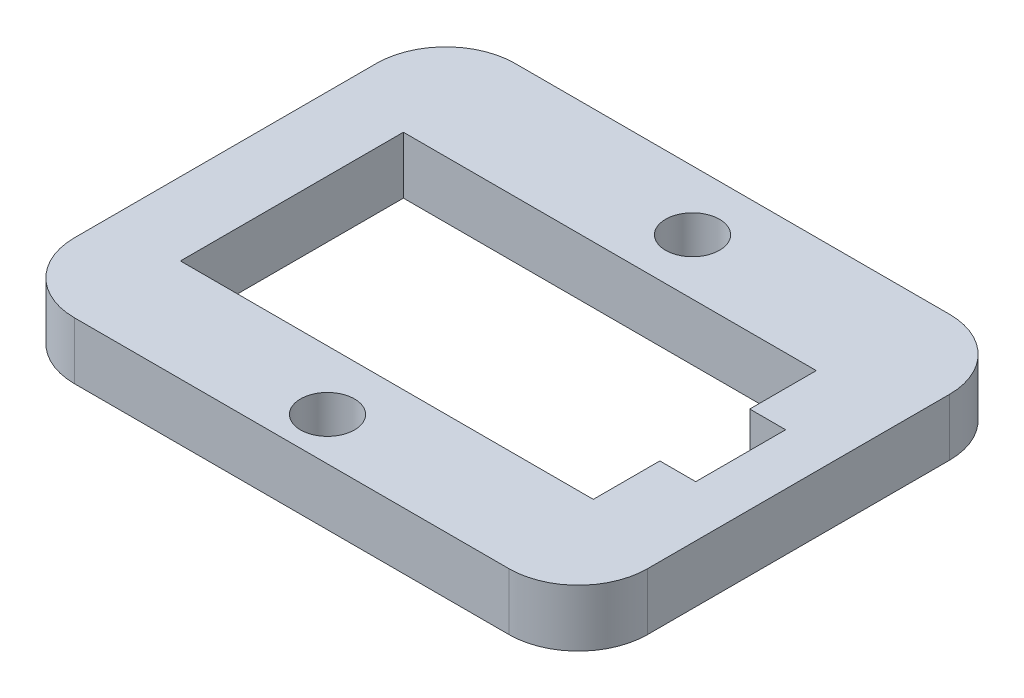
ISO-10303-21;
HEADER;
FILE_DESCRIPTION(('STEP AP214'),'2;1');
FILE_NAME('part.step','',(''),(''),'','','');
FILE_SCHEMA(('AUTOMOTIVE_DESIGN { 1 0 10303 214 1 1 1 1 }'));
ENDSEC;
DATA;
#1=APPLICATION_CONTEXT('core data for automotive mechanical design processes');
#2=APPLICATION_PROTOCOL_DEFINITION('international standard','automotive_design',2000,#1);
#3=PRODUCT_CONTEXT('',#1,'mechanical');
#4=PRODUCT('Part','Part','',(#3));
#5=PRODUCT_RELATED_PRODUCT_CATEGORY('part','',(#4));
#6=PRODUCT_DEFINITION_FORMATION('','',#4);
#7=PRODUCT_DEFINITION_CONTEXT('part definition',#1,'design');
#8=PRODUCT_DEFINITION('design','',#6,#7);
#9=PRODUCT_DEFINITION_SHAPE('','',#8);
#10=(LENGTH_UNIT() NAMED_UNIT(*) SI_UNIT(.MILLI.,.METRE.));
#11=(NAMED_UNIT(*) PLANE_ANGLE_UNIT() SI_UNIT($,.RADIAN.));
#12=(NAMED_UNIT(*) SI_UNIT($,.STERADIAN.) SOLID_ANGLE_UNIT());
#13=UNCERTAINTY_MEASURE_WITH_UNIT(LENGTH_MEASURE(1.E-05),#10,'distance_accuracy_value','');
#14=(GEOMETRIC_REPRESENTATION_CONTEXT(3) GLOBAL_UNCERTAINTY_ASSIGNED_CONTEXT((#13)) GLOBAL_UNIT_ASSIGNED_CONTEXT((#10,
#11,#12)) REPRESENTATION_CONTEXT('',''));
#15=CARTESIAN_POINT('',(0.,0.,0.));
#16=DIRECTION('',(0.,0.,1.));
#17=DIRECTION('',(1.,0.,0.));
#18=AXIS2_PLACEMENT_3D('',#15,#16,#17);
#19=CARTESIAN_POINT('',(-1.43212373794285,3.175,-11.8932817447668));
#20=DIRECTION('',(0.,1.,0.));
#21=DIRECTION('',(0.,0.,1.));
#22=AXIS2_PLACEMENT_3D('',#19,#20,#21);
#23=PLANE('',#22);
#24=CARTESIAN_POINT('',(-12.3988497530969,3.175,-12.4388628064113));
#25=DIRECTION('',(0.,1.,0.));
#26=DIRECTION('',(0.,0.,1.));
#27=AXIS2_PLACEMENT_3D('',#24,#25,#26);
#28=CIRCLE('',#27,1.4986);
#29=CARTESIAN_POINT('',(-12.3988497530969,3.175,-10.9402628064113));
#30=VERTEX_POINT('',#29);
#31=EDGE_CURVE('E184',#30,#30,#28,.T.);
#32=ORIENTED_EDGE('',*,*,#31,.F.);
#33=EDGE_LOOP('',(#32));
#34=FACE_BOUND('',#33,.T.);
#35=CARTESIAN_POINT('',(-1.43212373794285,3.175,-11.8932817447668));
#36=DIRECTION('',(0.,1.,0.));
#37=DIRECTION('',(0.,0.,1.));
#38=AXIS2_PLACEMENT_3D('',#35,#36,#37);
#39=CIRCLE('',#38,3.8628026619089);
#40=CARTESIAN_POINT('',(2.43067892396605,3.175,-11.8932817447668));
#41=VERTEX_POINT('',#40);
#42=CARTESIAN_POINT('',(-1.43212373794285,3.175,-15.7560844066757));
#43=VERTEX_POINT('',#42);
#44=EDGE_CURVE('E214',#41,#43,#39,.T.);
#45=ORIENTED_EDGE('',*,*,#44,.T.);
#46=DIRECTION('',(-1.,0.,0.));
#47=VECTOR('',#46,1.);
#48=CARTESIAN_POINT('',(-1.43212373794285,3.175,-15.7560844066757));
#49=LINE('',#48,#47);
#50=CARTESIAN_POINT('',(-25.5836145207176,3.175,-15.7560844066757));
#51=VERTEX_POINT('',#50);
#52=EDGE_CURVE('E217',#43,#51,#49,.T.);
#53=ORIENTED_EDGE('',*,*,#52,.T.);
#54=CARTESIAN_POINT('',(-25.5836145207176,3.175,-11.9002087767223));
#55=DIRECTION('',(0.,1.,0.));
#56=DIRECTION('',(0.,0.,1.));
#57=AXIS2_PLACEMENT_3D('',#54,#55,#56);
#58=CIRCLE('',#57,3.85587562995337);
#59=CARTESIAN_POINT('',(-29.439490150671,3.175,-11.9002087767223));
#60=VERTEX_POINT('',#59);
#61=EDGE_CURVE('E220',#51,#60,#58,.T.);
#62=ORIENTED_EDGE('',*,*,#61,.T.);
#63=DIRECTION('',(0.,0.,1.));
#64=VECTOR('',#63,1.);
#65=CARTESIAN_POINT('',(-29.439490150671,3.175,-11.9002087767223));
#66=LINE('',#65,#64);
#67=CARTESIAN_POINT('',(-29.439490150671,3.175,4.88188584073093));
#68=VERTEX_POINT('',#67);
#69=EDGE_CURVE('E222',#60,#68,#66,.T.);
#70=ORIENTED_EDGE('',*,*,#69,.T.);
#71=CARTESIAN_POINT('',(-25.576628785035,3.175,4.88188584073093));
#72=DIRECTION('',(0.,1.,0.));
#73=DIRECTION('',(0.,0.,1.));
#74=AXIS2_PLACEMENT_3D('',#71,#72,#73);
#75=CIRCLE('',#74,3.86286136563594);
#76=CARTESIAN_POINT('',(-25.576628785035,3.175,8.74474720636688));
#77=VERTEX_POINT('',#76);
#78=EDGE_CURVE('E224',#68,#77,#75,.T.);
#79=ORIENTED_EDGE('',*,*,#78,.T.);
#80=DIRECTION('',(1.,0.,0.));
#81=VECTOR('',#80,1.);
#82=CARTESIAN_POINT('',(-25.576628785035,3.175,8.74474720636688));
#83=LINE('',#82,#81);
#84=CARTESIAN_POINT('',(-1.42519682285525,3.175,8.74474720636688));
#85=VERTEX_POINT('',#84);
#86=EDGE_CURVE('E226',#77,#85,#83,.T.);
#87=ORIENTED_EDGE('',*,*,#86,.T.);
#88=CARTESIAN_POINT('',(-1.42519682285525,3.175,4.88887145954558));
#89=DIRECTION('',(0.,1.,0.));
#90=DIRECTION('',(0.,0.,1.));
#91=AXIS2_PLACEMENT_3D('',#88,#89,#90);
#92=CIRCLE('',#91,3.8558757468213);
#93=CARTESIAN_POINT('',(2.43067892396605,3.175,4.88887145954558));
#94=VERTEX_POINT('',#93);
#95=EDGE_CURVE('E228',#85,#94,#92,.T.);
#96=ORIENTED_EDGE('',*,*,#95,.T.);
#97=DIRECTION('',(0.,0.,-1.));
#98=VECTOR('',#97,1.);
#99=CARTESIAN_POINT('',(2.43067892396605,3.175,4.88887145954558));
#100=LINE('',#99,#98);
#101=EDGE_CURVE('E230',#94,#41,#100,.T.);
#102=ORIENTED_EDGE('',*,*,#101,.T.);
#103=EDGE_LOOP('',(#45,#53,#62,#70,#79,#87,#96,#102));
#104=FACE_BOUND('',#103,.T.);
#105=DIRECTION('',(-1.,0.,0.));
#106=VECTOR('',#105,1.);
#107=CARTESIAN_POINT('',(-2.41675038914363,3.175,-9.33874606572761));
#108=LINE('',#107,#106);
#109=CARTESIAN_POINT('',(-2.41675038914363,3.175,-9.33874606572761));
#110=VERTEX_POINT('',#109);
#111=CARTESIAN_POINT('',(-25.3759162308973,3.175,-9.33874606572761));
#112=VERTEX_POINT('',#111);
#113=EDGE_CURVE('E154',#110,#112,#108,.T.);
#114=ORIENTED_EDGE('',*,*,#113,.F.);
#115=DIRECTION('',(0.,0.,-1.));
#116=VECTOR('',#115,1.);
#117=CARTESIAN_POINT('',(-2.41675038914363,3.175,-5.63864642458049));
#118=LINE('',#117,#116);
#119=CARTESIAN_POINT('',(-2.41675038914363,3.175,-5.63864642458049));
#120=VERTEX_POINT('',#119);
#121=EDGE_CURVE('E146',#120,#110,#118,.T.);
#122=ORIENTED_EDGE('',*,*,#121,.F.);
#123=DIRECTION('',(-1.,0.,0.));
#124=VECTOR('',#123,1.);
#125=CARTESIAN_POINT('',(-0.420102398048572,3.175,-5.63864642458049));
#126=LINE('',#125,#124);
#127=CARTESIAN_POINT('',(-0.420102398048572,3.175,-5.63864642458049));
#128=VERTEX_POINT('',#127);
#129=EDGE_CURVE('E181',#128,#120,#126,.T.);
#130=ORIENTED_EDGE('',*,*,#129,.F.);
#131=DIRECTION('',(0.,0.,-1.));
#132=VECTOR('',#131,1.);
#133=CARTESIAN_POINT('',(-0.420102398048572,3.175,-0.638495937137135));
#134=LINE('',#133,#132);
#135=CARTESIAN_POINT('',(-0.420102398048572,3.175,-0.638495937137135));
#136=VERTEX_POINT('',#135);
#137=EDGE_CURVE('E179',#136,#128,#134,.T.);
#138=ORIENTED_EDGE('',*,*,#137,.F.);
#139=DIRECTION('',(1.,0.,0.));
#140=VECTOR('',#139,1.);
#141=CARTESIAN_POINT('',(-2.41675038914296,3.175,-0.638495937137135));
#142=LINE('',#141,#140);
#143=CARTESIAN_POINT('',(-2.41675038914296,3.175,-0.638495937137135));
#144=VERTEX_POINT('',#143);
#145=EDGE_CURVE('E177',#144,#136,#142,.T.);
#146=ORIENTED_EDGE('',*,*,#145,.F.);
#147=DIRECTION('',(0.,0.,-1.));
#148=VECTOR('',#147,1.);
#149=CARTESIAN_POINT('',(-2.41675038914296,3.175,3.06160370400997));
#150=LINE('',#149,#148);
#151=CARTESIAN_POINT('',(-2.41675038914296,3.175,3.06160370400997));
#152=VERTEX_POINT('',#151);
#153=EDGE_CURVE('E175',#152,#144,#150,.T.);
#154=ORIENTED_EDGE('',*,*,#153,.F.);
#155=DIRECTION('',(1.,0.,0.));
#156=VECTOR('',#155,1.);
#157=CARTESIAN_POINT('',(-25.3759162308973,3.175,3.06160370400997));
#158=LINE('',#157,#156);
#159=CARTESIAN_POINT('',(-25.3759162308973,3.175,3.06160370400997));
#160=VERTEX_POINT('',#159);
#161=EDGE_CURVE('E170',#160,#152,#158,.T.);
#162=ORIENTED_EDGE('',*,*,#161,.F.);
#163=DIRECTION('',(0.,0.,1.));
#164=VECTOR('',#163,1.);
#165=CARTESIAN_POINT('',(-25.3759162308973,3.175,-9.33874606572761));
#166=LINE('',#165,#164);
#167=EDGE_CURVE('E168',#112,#160,#166,.T.);
#168=ORIENTED_EDGE('',*,*,#167,.F.);
#169=EDGE_LOOP('',(#114,#122,#130,#138,#146,#154,#162,#168));
#170=FACE_BOUND('',#169,.T.);
#171=CARTESIAN_POINT('',(-13.8963966762532,3.175,6.36179287626992));
#172=DIRECTION('',(0.,1.,0.));
#173=DIRECTION('',(0.,0.,1.));
#174=AXIS2_PLACEMENT_3D('',#171,#172,#173);
#175=CIRCLE('',#174,1.4986);
#176=CARTESIAN_POINT('',(-13.8963966762532,3.175,7.86039287626992));
#177=VERTEX_POINT('',#176);
#178=EDGE_CURVE('E370',#177,#177,#175,.T.);
#179=ORIENTED_EDGE('',*,*,#178,.F.);
#180=EDGE_LOOP('',(#179));
#181=FACE_BOUND('',#180,.T.);
#182=ADVANCED_FACE('F33',(#34,#104,#170,#181),#23,.T.);
#183=CARTESIAN_POINT('',(-1.43212373794285,0.,-11.8932817447668));
#184=DIRECTION('',(0.,1.,0.));
#185=DIRECTION('',(0.,0.,1.));
#186=AXIS2_PLACEMENT_3D('',#183,#184,#185);
#187=PLANE('',#186);
#188=CARTESIAN_POINT('',(-1.43212373794285,0.,-11.8932817447668));
#189=DIRECTION('',(0.,1.,0.));
#190=DIRECTION('',(0.,0.,1.));
#191=AXIS2_PLACEMENT_3D('',#188,#189,#190);
#192=CIRCLE('',#191,3.8628026619089);
#193=CARTESIAN_POINT('',(2.43067892396605,0.,-11.8932817447668));
#194=VERTEX_POINT('',#193);
#195=CARTESIAN_POINT('',(-1.43212373794285,0.,-15.7560844066757));
#196=VERTEX_POINT('',#195);
#197=EDGE_CURVE('E162',#194,#196,#192,.T.);
#198=ORIENTED_EDGE('',*,*,#197,.F.);
#199=DIRECTION('',(0.,0.,-1.));
#200=VECTOR('',#199,1.);
#201=CARTESIAN_POINT('',(2.43067892396605,0.,4.88887145954558));
#202=LINE('',#201,#200);
#203=CARTESIAN_POINT('',(2.43067892396605,0.,4.88887145954558));
#204=VERTEX_POINT('',#203);
#205=EDGE_CURVE('E218',#204,#194,#202,.T.);
#206=ORIENTED_EDGE('',*,*,#205,.F.);
#207=CARTESIAN_POINT('',(-1.42519682285525,0.,4.88887145954558));
#208=DIRECTION('',(0.,1.,0.));
#209=DIRECTION('',(0.,0.,1.));
#210=AXIS2_PLACEMENT_3D('',#207,#208,#209);
#211=CIRCLE('',#210,3.8558757468213);
#212=CARTESIAN_POINT('',(-1.42519682285525,0.,8.74474720636688));
#213=VERTEX_POINT('',#212);
#214=EDGE_CURVE('E245',#213,#204,#211,.T.);
#215=ORIENTED_EDGE('',*,*,#214,.F.);
#216=DIRECTION('',(1.,0.,0.));
#217=VECTOR('',#216,1.);
#218=CARTESIAN_POINT('',(-25.576628785035,0.,8.74474720636688));
#219=LINE('',#218,#217);
#220=CARTESIAN_POINT('',(-25.576628785035,0.,8.74474720636688));
#221=VERTEX_POINT('',#220);
#222=EDGE_CURVE('E243',#221,#213,#219,.T.);
#223=ORIENTED_EDGE('',*,*,#222,.F.);
#224=CARTESIAN_POINT('',(-25.576628785035,0.,4.88188584073093));
#225=DIRECTION('',(0.,1.,0.));
#226=DIRECTION('',(0.,0.,1.));
#227=AXIS2_PLACEMENT_3D('',#224,#225,#226);
#228=CIRCLE('',#227,3.86286136563594);
#229=CARTESIAN_POINT('',(-29.439490150671,0.,4.88188584073093));
#230=VERTEX_POINT('',#229);
#231=EDGE_CURVE('E241',#230,#221,#228,.T.);
#232=ORIENTED_EDGE('',*,*,#231,.F.);
#233=DIRECTION('',(0.,0.,1.));
#234=VECTOR('',#233,1.);
#235=CARTESIAN_POINT('',(-29.439490150671,0.,-11.9002087767223));
#236=LINE('',#235,#234);
#237=CARTESIAN_POINT('',(-29.439490150671,0.,-11.9002087767223));
#238=VERTEX_POINT('',#237);
#239=EDGE_CURVE('E239',#238,#230,#236,.T.);
#240=ORIENTED_EDGE('',*,*,#239,.F.);
#241=CARTESIAN_POINT('',(-25.5836145207176,0.,-11.9002087767223));
#242=DIRECTION('',(0.,1.,0.));
#243=DIRECTION('',(0.,0.,1.));
#244=AXIS2_PLACEMENT_3D('',#241,#242,#243);
#245=CIRCLE('',#244,3.85587562995337);
#246=CARTESIAN_POINT('',(-25.5836145207176,0.,-15.7560844066757));
#247=VERTEX_POINT('',#246);
#248=EDGE_CURVE('E237',#247,#238,#245,.T.);
#249=ORIENTED_EDGE('',*,*,#248,.F.);
#250=DIRECTION('',(-1.,0.,0.));
#251=VECTOR('',#250,1.);
#252=CARTESIAN_POINT('',(-1.43212373794285,0.,-15.7560844066757));
#253=LINE('',#252,#251);
#254=EDGE_CURVE('E235',#196,#247,#253,.T.);
#255=ORIENTED_EDGE('',*,*,#254,.F.);
#256=EDGE_LOOP('',(#198,#206,#215,#223,#232,#240,#249,#255));
#257=FACE_BOUND('',#256,.T.);
#258=DIRECTION('',(0.,0.,-1.));
#259=VECTOR('',#258,1.);
#260=CARTESIAN_POINT('',(-2.41675038914363,0.,-5.63864642458049));
#261=LINE('',#260,#259);
#262=CARTESIAN_POINT('',(-2.41675038914363,0.,-5.63864642458049));
#263=VERTEX_POINT('',#262);
#264=CARTESIAN_POINT('',(-2.41675038914363,0.,-9.33874606572761));
#265=VERTEX_POINT('',#264);
#266=EDGE_CURVE('E56',#263,#265,#261,.T.);
#267=ORIENTED_EDGE('',*,*,#266,.T.);
#268=DIRECTION('',(-1.,0.,0.));
#269=VECTOR('',#268,1.);
#270=CARTESIAN_POINT('',(-2.41675038914363,0.,-9.33874606572761));
#271=LINE('',#270,#269);
#272=CARTESIAN_POINT('',(-25.3759162308973,0.,-9.33874606572761));
#273=VERTEX_POINT('',#272);
#274=EDGE_CURVE('E161',#265,#273,#271,.T.);
#275=ORIENTED_EDGE('',*,*,#274,.T.);
#276=DIRECTION('',(0.,0.,1.));
#277=VECTOR('',#276,1.);
#278=CARTESIAN_POINT('',(-25.3759162308973,0.,-9.33874606572761));
#279=LINE('',#278,#277);
#280=CARTESIAN_POINT('',(-25.3759162308973,0.,3.06160370400997));
#281=VERTEX_POINT('',#280);
#282=EDGE_CURVE('E186',#273,#281,#279,.T.);
#283=ORIENTED_EDGE('',*,*,#282,.T.);
#284=DIRECTION('',(1.,0.,0.));
#285=VECTOR('',#284,1.);
#286=CARTESIAN_POINT('',(-25.3759162308973,0.,3.06160370400997));
#287=LINE('',#286,#285);
#288=CARTESIAN_POINT('',(-2.41675038914296,0.,3.06160370400997));
#289=VERTEX_POINT('',#288);
#290=EDGE_CURVE('E189',#281,#289,#287,.T.);
#291=ORIENTED_EDGE('',*,*,#290,.T.);
#292=DIRECTION('',(0.,0.,-1.));
#293=VECTOR('',#292,1.);
#294=CARTESIAN_POINT('',(-2.41675038914296,0.,3.06160370400997));
#295=LINE('',#294,#293);
#296=CARTESIAN_POINT('',(-2.41675038914296,0.,-0.638495937137135));
#297=VERTEX_POINT('',#296);
#298=EDGE_CURVE('E192',#289,#297,#295,.T.);
#299=ORIENTED_EDGE('',*,*,#298,.T.);
#300=DIRECTION('',(1.,0.,0.));
#301=VECTOR('',#300,1.);
#302=CARTESIAN_POINT('',(-2.41675038914296,0.,-0.638495937137135));
#303=LINE('',#302,#301);
#304=CARTESIAN_POINT('',(-0.420102398048572,0.,-0.638495937137135));
#305=VERTEX_POINT('',#304);
#306=EDGE_CURVE('E195',#297,#305,#303,.T.);
#307=ORIENTED_EDGE('',*,*,#306,.T.);
#308=DIRECTION('',(0.,0.,-1.));
#309=VECTOR('',#308,1.);
#310=CARTESIAN_POINT('',(-0.420102398048572,0.,-0.638495937137135));
#311=LINE('',#310,#309);
#312=CARTESIAN_POINT('',(-0.420102398048572,0.,-5.63864642458049));
#313=VERTEX_POINT('',#312);
#314=EDGE_CURVE('E198',#305,#313,#311,.T.);
#315=ORIENTED_EDGE('',*,*,#314,.T.);
#316=DIRECTION('',(-1.,0.,0.));
#317=VECTOR('',#316,1.);
#318=CARTESIAN_POINT('',(-0.420102398048572,0.,-5.63864642458049));
#319=LINE('',#318,#317);
#320=EDGE_CURVE('E155',#313,#263,#319,.T.);
#321=ORIENTED_EDGE('',*,*,#320,.T.);
#322=EDGE_LOOP('',(#267,#275,#283,#291,#299,#307,#315,#321));
#323=FACE_BOUND('',#322,.T.);
#324=CARTESIAN_POINT('',(-12.3988497530969,0.,-12.4388628064113));
#325=DIRECTION('',(0.,1.,0.));
#326=DIRECTION('',(0.,0.,1.));
#327=AXIS2_PLACEMENT_3D('',#324,#325,#326);
#328=CIRCLE('',#327,1.4986);
#329=CARTESIAN_POINT('',(-12.3988497530969,0.,-10.9402628064113));
#330=VERTEX_POINT('',#329);
#331=EDGE_CURVE('E376',#330,#330,#328,.T.);
#332=ORIENTED_EDGE('',*,*,#331,.T.);
#333=EDGE_LOOP('',(#332));
#334=FACE_BOUND('',#333,.T.);
#335=CARTESIAN_POINT('',(-13.8963966762532,0.,6.36179287626992));
#336=DIRECTION('',(0.,1.,0.));
#337=DIRECTION('',(0.,0.,1.));
#338=AXIS2_PLACEMENT_3D('',#335,#336,#337);
#339=CIRCLE('',#338,1.4986);
#340=CARTESIAN_POINT('',(-13.8963966762532,0.,7.86039287626992));
#341=VERTEX_POINT('',#340);
#342=EDGE_CURVE('E373',#341,#341,#339,.T.);
#343=ORIENTED_EDGE('',*,*,#342,.T.);
#344=EDGE_LOOP('',(#343));
#345=FACE_BOUND('',#344,.T.);
#346=ADVANCED_FACE('F275',(#257,#323,#334,#345),#187,.F.);
#347=CARTESIAN_POINT('',(-1.43212373794285,3.175,-11.8932817447668));
#348=DIRECTION('',(0.,-1.,0.));
#349=DIRECTION('',(0.,0.,-1.));
#350=AXIS2_PLACEMENT_3D('',#347,#348,#349);
#351=CYLINDRICAL_SURFACE('',#350,3.8628026619089);
#352=ORIENTED_EDGE('',*,*,#197,.T.);
#353=DIRECTION('',(0.,-1.,0.));
#354=VECTOR('',#353,1.);
#355=CARTESIAN_POINT('',(-1.43212373794285,3.175,-15.7560844066757));
#356=LINE('',#355,#354);
#357=EDGE_CURVE('E11',#43,#196,#356,.T.);
#358=ORIENTED_EDGE('',*,*,#357,.F.);
#359=ORIENTED_EDGE('',*,*,#44,.F.);
#360=DIRECTION('',(0.,-1.,0.));
#361=VECTOR('',#360,1.);
#362=CARTESIAN_POINT('',(2.43067892396605,3.175,-11.8932817447668));
#363=LINE('',#362,#361);
#364=EDGE_CURVE('E232',#41,#194,#363,.T.);
#365=ORIENTED_EDGE('',*,*,#364,.T.);
#366=EDGE_LOOP('',(#352,#358,#359,#365));
#367=FACE_BOUND('',#366,.T.);
#368=ADVANCED_FACE('F35',(#367),#351,.T.);
#369=CARTESIAN_POINT('',(-1.43212373794285,3.175,-15.7560844066757));
#370=DIRECTION('',(0.,0.,1.));
#371=DIRECTION('',(1.,0.,0.));
#372=AXIS2_PLACEMENT_3D('',#369,#370,#371);
#373=PLANE('',#372);
#374=ORIENTED_EDGE('',*,*,#254,.T.);
#375=DIRECTION('',(0.,-1.,0.));
#376=VECTOR('',#375,1.);
#377=CARTESIAN_POINT('',(-25.5836145207176,3.175,-15.7560844066757));
#378=LINE('',#377,#376);
#379=EDGE_CURVE('E41',#51,#247,#378,.T.);
#380=ORIENTED_EDGE('',*,*,#379,.F.);
#381=ORIENTED_EDGE('',*,*,#52,.F.);
#382=ORIENTED_EDGE('',*,*,#357,.T.);
#383=EDGE_LOOP('',(#374,#380,#381,#382));
#384=FACE_BOUND('',#383,.T.);
#385=ADVANCED_FACE('F292',(#384),#373,.F.);
#386=CARTESIAN_POINT('',(-25.5836145207176,3.175,-11.9002087767223));
#387=DIRECTION('',(0.,-1.,0.));
#388=DIRECTION('',(0.,0.,-1.));
#389=AXIS2_PLACEMENT_3D('',#386,#387,#388);
#390=CYLINDRICAL_SURFACE('',#389,3.85587562995337);
#391=ORIENTED_EDGE('',*,*,#248,.T.);
#392=DIRECTION('',(0.,-1.,0.));
#393=VECTOR('',#392,1.);
#394=CARTESIAN_POINT('',(-29.439490150671,3.175,-11.9002087767223));
#395=LINE('',#394,#393);
#396=EDGE_CURVE('E262',#60,#238,#395,.T.);
#397=ORIENTED_EDGE('',*,*,#396,.F.);
#398=ORIENTED_EDGE('',*,*,#61,.F.);
#399=ORIENTED_EDGE('',*,*,#379,.T.);
#400=EDGE_LOOP('',(#391,#397,#398,#399));
#401=FACE_BOUND('',#400,.T.);
#402=ADVANCED_FACE('F269',(#401),#390,.T.);
#403=CARTESIAN_POINT('',(-29.439490150671,3.175,-11.9002087767223));
#404=DIRECTION('',(1.,0.,0.));
#405=DIRECTION('',(0.,0.,-1.));
#406=AXIS2_PLACEMENT_3D('',#403,#404,#405);
#407=PLANE('',#406);
#408=ORIENTED_EDGE('',*,*,#239,.T.);
#409=DIRECTION('',(0.,-1.,0.));
#410=VECTOR('',#409,1.);
#411=CARTESIAN_POINT('',(-29.439490150671,3.175,4.88188584073093));
#412=LINE('',#411,#410);
#413=EDGE_CURVE('E259',#68,#230,#412,.T.);
#414=ORIENTED_EDGE('',*,*,#413,.F.);
#415=ORIENTED_EDGE('',*,*,#69,.F.);
#416=ORIENTED_EDGE('',*,*,#396,.T.);
#417=EDGE_LOOP('',(#408,#414,#415,#416));
#418=FACE_BOUND('',#417,.T.);
#419=ADVANCED_FACE('F281',(#418),#407,.F.);
#420=CARTESIAN_POINT('',(-25.576628785035,3.175,4.88188584073093));
#421=DIRECTION('',(0.,-1.,0.));
#422=DIRECTION('',(0.,0.,-1.));
#423=AXIS2_PLACEMENT_3D('',#420,#421,#422);
#424=CYLINDRICAL_SURFACE('',#423,3.86286136563594);
#425=ORIENTED_EDGE('',*,*,#231,.T.);
#426=DIRECTION('',(0.,-1.,0.));
#427=VECTOR('',#426,1.);
#428=CARTESIAN_POINT('',(-25.576628785035,3.175,8.74474720636688));
#429=LINE('',#428,#427);
#430=EDGE_CURVE('E256',#77,#221,#429,.T.);
#431=ORIENTED_EDGE('',*,*,#430,.F.);
#432=ORIENTED_EDGE('',*,*,#78,.F.);
#433=ORIENTED_EDGE('',*,*,#413,.T.);
#434=EDGE_LOOP('',(#425,#431,#432,#433));
#435=FACE_BOUND('',#434,.T.);
#436=ADVANCED_FACE('F285',(#435),#424,.T.);
#437=CARTESIAN_POINT('',(-25.576628785035,3.175,8.74474720636688));
#438=DIRECTION('',(0.,0.,-1.));
#439=DIRECTION('',(-1.,0.,0.));
#440=AXIS2_PLACEMENT_3D('',#437,#438,#439);
#441=PLANE('',#440);
#442=ORIENTED_EDGE('',*,*,#222,.T.);
#443=DIRECTION('',(0.,-1.,0.));
#444=VECTOR('',#443,1.);
#445=CARTESIAN_POINT('',(-1.42519682285525,3.175,8.74474720636688));
#446=LINE('',#445,#444);
#447=EDGE_CURVE('E253',#85,#213,#446,.T.);
#448=ORIENTED_EDGE('',*,*,#447,.F.);
#449=ORIENTED_EDGE('',*,*,#86,.F.);
#450=ORIENTED_EDGE('',*,*,#430,.T.);
#451=EDGE_LOOP('',(#442,#448,#449,#450));
#452=FACE_BOUND('',#451,.T.);
#453=ADVANCED_FACE('F305',(#452),#441,.F.);
#454=CARTESIAN_POINT('',(-1.42519682285525,3.175,4.88887145954558));
#455=DIRECTION('',(0.,-1.,0.));
#456=DIRECTION('',(0.,0.,-1.));
#457=AXIS2_PLACEMENT_3D('',#454,#455,#456);
#458=CYLINDRICAL_SURFACE('',#457,3.8558757468213);
#459=ORIENTED_EDGE('',*,*,#214,.T.);
#460=DIRECTION('',(0.,-1.,0.));
#461=VECTOR('',#460,1.);
#462=CARTESIAN_POINT('',(2.43067892396605,3.175,4.88887145954558));
#463=LINE('',#462,#461);
#464=EDGE_CURVE('E250',#94,#204,#463,.T.);
#465=ORIENTED_EDGE('',*,*,#464,.F.);
#466=ORIENTED_EDGE('',*,*,#95,.F.);
#467=ORIENTED_EDGE('',*,*,#447,.T.);
#468=EDGE_LOOP('',(#459,#465,#466,#467));
#469=FACE_BOUND('',#468,.T.);
#470=ADVANCED_FACE('F303',(#469),#458,.T.);
#471=CARTESIAN_POINT('',(2.43067892396605,3.175,4.88887145954558));
#472=DIRECTION('',(-1.,0.,0.));
#473=DIRECTION('',(0.,0.,1.));
#474=AXIS2_PLACEMENT_3D('',#471,#472,#473);
#475=PLANE('',#474);
#476=ORIENTED_EDGE('',*,*,#205,.T.);
#477=ORIENTED_EDGE('',*,*,#364,.F.);
#478=ORIENTED_EDGE('',*,*,#101,.F.);
#479=ORIENTED_EDGE('',*,*,#464,.T.);
#480=EDGE_LOOP('',(#476,#477,#478,#479));
#481=FACE_BOUND('',#480,.T.);
#482=ADVANCED_FACE('F298',(#481),#475,.F.);
#483=CARTESIAN_POINT('',(-2.41675038914363,3.175,-5.63864642458049));
#484=DIRECTION('',(-1.,0.,0.));
#485=DIRECTION('',(0.,0.,1.));
#486=AXIS2_PLACEMENT_3D('',#483,#484,#485);
#487=PLANE('',#486);
#488=ORIENTED_EDGE('',*,*,#266,.F.);
#489=DIRECTION('',(0.,-1.,0.));
#490=VECTOR('',#489,1.);
#491=CARTESIAN_POINT('',(-2.41675038914363,3.175,-5.63864642458049));
#492=LINE('',#491,#490);
#493=EDGE_CURVE('E150',#120,#263,#492,.T.);
#494=ORIENTED_EDGE('',*,*,#493,.F.);
#495=ORIENTED_EDGE('',*,*,#121,.T.);
#496=DIRECTION('',(0.,-1.,0.));
#497=VECTOR('',#496,1.);
#498=CARTESIAN_POINT('',(-2.41675038914363,3.175,-9.33874606572761));
#499=LINE('',#498,#497);
#500=EDGE_CURVE('E149',#110,#265,#499,.T.);
#501=ORIENTED_EDGE('',*,*,#500,.T.);
#502=EDGE_LOOP('',(#488,#494,#495,#501));
#503=FACE_BOUND('',#502,.T.);
#504=ADVANCED_FACE('F148',(#503),#487,.T.);
#505=CARTESIAN_POINT('',(-2.41675038914363,3.175,-9.33874606572761));
#506=DIRECTION('',(0.,0.,1.));
#507=DIRECTION('',(1.,0.,0.));
#508=AXIS2_PLACEMENT_3D('',#505,#506,#507);
#509=PLANE('',#508);
#510=ORIENTED_EDGE('',*,*,#274,.F.);
#511=ORIENTED_EDGE('',*,*,#500,.F.);
#512=ORIENTED_EDGE('',*,*,#113,.T.);
#513=DIRECTION('',(0.,-1.,0.));
#514=VECTOR('',#513,1.);
#515=CARTESIAN_POINT('',(-25.3759162308973,3.175,-9.33874606572761));
#516=LINE('',#515,#514);
#517=EDGE_CURVE('E163',#112,#273,#516,.T.);
#518=ORIENTED_EDGE('',*,*,#517,.T.);
#519=EDGE_LOOP('',(#510,#511,#512,#518));
#520=FACE_BOUND('',#519,.T.);
#521=ADVANCED_FACE('F158',(#520),#509,.T.);
#522=CARTESIAN_POINT('',(-25.3759162308973,3.175,-9.33874606572761));
#523=DIRECTION('',(1.,0.,0.));
#524=DIRECTION('',(0.,0.,-1.));
#525=AXIS2_PLACEMENT_3D('',#522,#523,#524);
#526=PLANE('',#525);
#527=ORIENTED_EDGE('',*,*,#282,.F.);
#528=ORIENTED_EDGE('',*,*,#517,.F.);
#529=ORIENTED_EDGE('',*,*,#167,.T.);
#530=DIRECTION('',(0.,-1.,0.));
#531=VECTOR('',#530,1.);
#532=CARTESIAN_POINT('',(-25.3759162308973,3.175,3.06160370400997));
#533=LINE('',#532,#531);
#534=EDGE_CURVE('E211',#160,#281,#533,.T.);
#535=ORIENTED_EDGE('',*,*,#534,.T.);
#536=EDGE_LOOP('',(#527,#528,#529,#535));
#537=FACE_BOUND('',#536,.T.);
#538=ADVANCED_FACE('F332',(#537),#526,.T.);
#539=CARTESIAN_POINT('',(-25.3759162308973,3.175,3.06160370400997));
#540=DIRECTION('',(0.,0.,-1.));
#541=DIRECTION('',(-1.,0.,0.));
#542=AXIS2_PLACEMENT_3D('',#539,#540,#541);
#543=PLANE('',#542);
#544=ORIENTED_EDGE('',*,*,#290,.F.);
#545=ORIENTED_EDGE('',*,*,#534,.F.);
#546=ORIENTED_EDGE('',*,*,#161,.T.);
#547=DIRECTION('',(0.,-1.,0.));
#548=VECTOR('',#547,1.);
#549=CARTESIAN_POINT('',(-2.41675038914296,3.175,3.06160370400997));
#550=LINE('',#549,#548);
#551=EDGE_CURVE('E209',#152,#289,#550,.T.);
#552=ORIENTED_EDGE('',*,*,#551,.T.);
#553=EDGE_LOOP('',(#544,#545,#546,#552));
#554=FACE_BOUND('',#553,.T.);
#555=ADVANCED_FACE('F336',(#554),#543,.T.);
#556=CARTESIAN_POINT('',(-2.41675038914296,3.175,3.06160370400997));
#557=DIRECTION('',(-1.,0.,0.));
#558=DIRECTION('',(0.,0.,1.));
#559=AXIS2_PLACEMENT_3D('',#556,#557,#558);
#560=PLANE('',#559);
#561=ORIENTED_EDGE('',*,*,#298,.F.);
#562=ORIENTED_EDGE('',*,*,#551,.F.);
#563=ORIENTED_EDGE('',*,*,#153,.T.);
#564=DIRECTION('',(0.,-1.,0.));
#565=VECTOR('',#564,1.);
#566=CARTESIAN_POINT('',(-2.41675038914296,3.175,-0.638495937137135));
#567=LINE('',#566,#565);
#568=EDGE_CURVE('E207',#144,#297,#567,.T.);
#569=ORIENTED_EDGE('',*,*,#568,.T.);
#570=EDGE_LOOP('',(#561,#562,#563,#569));
#571=FACE_BOUND('',#570,.T.);
#572=ADVANCED_FACE('F342',(#571),#560,.T.);
#573=CARTESIAN_POINT('',(-2.41675038914296,3.175,-0.638495937137135));
#574=DIRECTION('',(0.,0.,-1.));
#575=DIRECTION('',(-1.,0.,0.));
#576=AXIS2_PLACEMENT_3D('',#573,#574,#575);
#577=PLANE('',#576);
#578=ORIENTED_EDGE('',*,*,#306,.F.);
#579=ORIENTED_EDGE('',*,*,#568,.F.);
#580=ORIENTED_EDGE('',*,*,#145,.T.);
#581=DIRECTION('',(0.,-1.,0.));
#582=VECTOR('',#581,1.);
#583=CARTESIAN_POINT('',(-0.420102398048572,3.175,-0.638495937137135));
#584=LINE('',#583,#582);
#585=EDGE_CURVE('E205',#136,#305,#584,.T.);
#586=ORIENTED_EDGE('',*,*,#585,.T.);
#587=EDGE_LOOP('',(#578,#579,#580,#586));
#588=FACE_BOUND('',#587,.T.);
#589=ADVANCED_FACE('F346',(#588),#577,.T.);
#590=CARTESIAN_POINT('',(-0.420102398048572,3.175,-0.638495937137135));
#591=DIRECTION('',(-1.,0.,0.));
#592=DIRECTION('',(0.,0.,1.));
#593=AXIS2_PLACEMENT_3D('',#590,#591,#592);
#594=PLANE('',#593);
#595=ORIENTED_EDGE('',*,*,#314,.F.);
#596=ORIENTED_EDGE('',*,*,#585,.F.);
#597=ORIENTED_EDGE('',*,*,#137,.T.);
#598=DIRECTION('',(0.,-1.,0.));
#599=VECTOR('',#598,1.);
#600=CARTESIAN_POINT('',(-0.420102398048572,3.175,-5.63864642458049));
#601=LINE('',#600,#599);
#602=EDGE_CURVE('E48',#128,#313,#601,.T.);
#603=ORIENTED_EDGE('',*,*,#602,.T.);
#604=EDGE_LOOP('',(#595,#596,#597,#603));
#605=FACE_BOUND('',#604,.T.);
#606=ADVANCED_FACE('F350',(#605),#594,.T.);
#607=CARTESIAN_POINT('',(-0.420102398048572,3.175,-5.63864642458049));
#608=DIRECTION('',(0.,0.,1.));
#609=DIRECTION('',(1.,0.,0.));
#610=AXIS2_PLACEMENT_3D('',#607,#608,#609);
#611=PLANE('',#610);
#612=ORIENTED_EDGE('',*,*,#320,.F.);
#613=ORIENTED_EDGE('',*,*,#602,.F.);
#614=ORIENTED_EDGE('',*,*,#129,.T.);
#615=ORIENTED_EDGE('',*,*,#493,.T.);
#616=EDGE_LOOP('',(#612,#613,#614,#615));
#617=FACE_BOUND('',#616,.T.);
#618=ADVANCED_FACE('F354',(#617),#611,.T.);
#619=CARTESIAN_POINT('',(-12.3988497530969,3.175,-12.4388628064113));
#620=DIRECTION('',(0.,-1.,0.));
#621=DIRECTION('',(0.,0.,-1.));
#622=AXIS2_PLACEMENT_3D('',#619,#620,#621);
#623=CYLINDRICAL_SURFACE('',#622,1.4986);
#624=ORIENTED_EDGE('',*,*,#31,.T.);
#625=EDGE_LOOP('',(#624));
#626=FACE_BOUND('',#625,.T.);
#627=ORIENTED_EDGE('',*,*,#331,.F.);
#628=EDGE_LOOP('',(#627));
#629=FACE_BOUND('',#628,.T.);
#630=ADVANCED_FACE('F358',(#626,#629),#623,.F.);
#631=CARTESIAN_POINT('',(-13.8963966762532,3.175,6.36179287626992));
#632=DIRECTION('',(0.,-1.,0.));
#633=DIRECTION('',(0.,0.,-1.));
#634=AXIS2_PLACEMENT_3D('',#631,#632,#633);
#635=CYLINDRICAL_SURFACE('',#634,1.4986);
#636=ORIENTED_EDGE('',*,*,#178,.T.);
#637=EDGE_LOOP('',(#636));
#638=FACE_BOUND('',#637,.T.);
#639=ORIENTED_EDGE('',*,*,#342,.F.);
#640=EDGE_LOOP('',(#639));
#641=FACE_BOUND('',#640,.T.);
#642=ADVANCED_FACE('F361',(#638,#641),#635,.F.);
#643=CLOSED_SHELL('',(#182,#346,#368,#385,#402,#419,#436,#453,#470,#482,#504,#521,#538,#555,
#572,#589,#606,#618,#630,#642));
#644=MANIFOLD_SOLID_BREP('B2',#643);
#645=ADVANCED_BREP_SHAPE_REPRESENTATION('',(#18,#644),#14);
#646=SHAPE_DEFINITION_REPRESENTATION(#9,#645);
ENDSEC;
END-ISO-10303-21;
